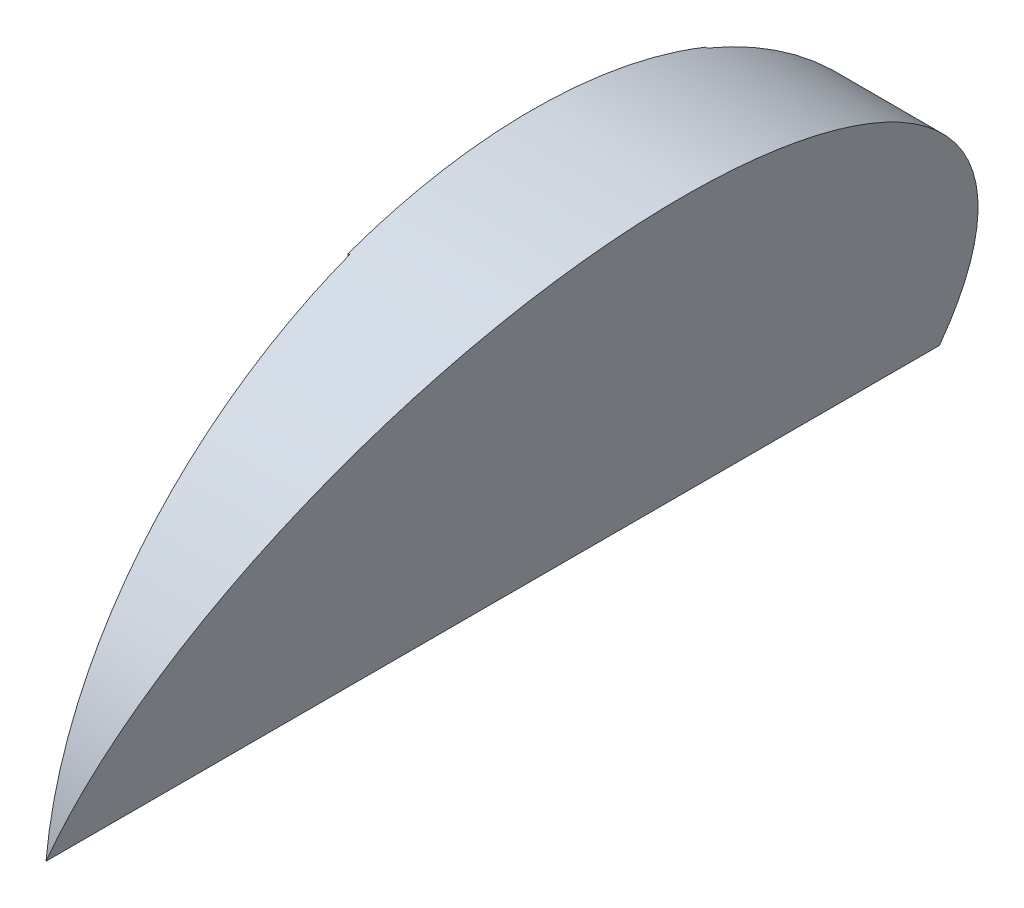
ISO-10303-21;
HEADER;
FILE_DESCRIPTION(('STEP AP214'),'2;1');
FILE_NAME('part.step','',(''),(''),'','','');
FILE_SCHEMA(('AUTOMOTIVE_DESIGN { 1 0 10303 214 1 1 1 1 }'));
ENDSEC;
DATA;
#1=APPLICATION_CONTEXT('core data for automotive mechanical design processes');
#2=APPLICATION_PROTOCOL_DEFINITION('international standard','automotive_design',2000,#1);
#3=PRODUCT_CONTEXT('',#1,'mechanical');
#4=PRODUCT('Part','Part','',(#3));
#5=PRODUCT_RELATED_PRODUCT_CATEGORY('part','',(#4));
#6=PRODUCT_DEFINITION_FORMATION('','',#4);
#7=PRODUCT_DEFINITION_CONTEXT('part definition',#1,'design');
#8=PRODUCT_DEFINITION('design','',#6,#7);
#9=PRODUCT_DEFINITION_SHAPE('','',#8);
#10=(LENGTH_UNIT() NAMED_UNIT(*) SI_UNIT(.MILLI.,.METRE.));
#11=(NAMED_UNIT(*) PLANE_ANGLE_UNIT() SI_UNIT($,.RADIAN.));
#12=(NAMED_UNIT(*) SI_UNIT($,.STERADIAN.) SOLID_ANGLE_UNIT());
#13=UNCERTAINTY_MEASURE_WITH_UNIT(LENGTH_MEASURE(1.E-05),#10,'distance_accuracy_value','');
#14=(GEOMETRIC_REPRESENTATION_CONTEXT(3) GLOBAL_UNCERTAINTY_ASSIGNED_CONTEXT((#13)) GLOBAL_UNIT_ASSIGNED_CONTEXT((#10,
#11,#12)) REPRESENTATION_CONTEXT('',''));
#15=CARTESIAN_POINT('',(0.,0.,0.));
#16=DIRECTION('',(0.,0.,1.));
#17=DIRECTION('',(1.,0.,0.));
#18=AXIS2_PLACEMENT_3D('',#15,#16,#17);
#19=CARTESIAN_POINT('',(6.99909308207423,80.,-80.));
#20=DIRECTION('',(-0.996194698091745,0.087155742747662,0.));
#21=DIRECTION('',(-0.087155742747662,-0.996194698091745,0.));
#22=AXIS2_PLACEMENT_3D('',#19,#20,#21);
#23=PLANE('',#22);
#24=CARTESIAN_POINT('',(0.,0.,0.));
#25=DIRECTION('',(-0.996194698091745,0.087155742747662,0.));
#26=DIRECTION('',(-0.087155742747662,-0.996194698091745,0.));
#27=AXIS2_PLACEMENT_3D('',#24,#25,#26);
#28=ELLIPSE('',#27,80.3055870034678,80.);
#29=CARTESIAN_POINT('',(6.41477476892939,73.3212111192935,32.));
#30=VERTEX_POINT('',#29);
#31=CARTESIAN_POINT('',(0.,0.,80.));
#32=VERTEX_POINT('',#31);
#33=EDGE_CURVE('E180',#30,#32,#28,.F.);
#34=ORIENTED_EDGE('',*,*,#33,.F.);
#35=DIRECTION('',(-0.0871557427476621,-0.996194698091745,0.));
#36=VECTOR('',#35,1.);
#37=CARTESIAN_POINT('',(6.99909308207423,80.,32.));
#38=LINE('',#37,#36);
#39=CARTESIAN_POINT('',(0.,0.,32.));
#40=VERTEX_POINT('',#39);
#41=EDGE_CURVE('E189',#30,#40,#38,.T.);
#42=ORIENTED_EDGE('',*,*,#41,.T.);
#43=DIRECTION('',(0.,0.,1.));
#44=VECTOR('',#43,1.);
#45=CARTESIAN_POINT('',(0.,0.,-80.));
#46=LINE('',#45,#44);
#47=EDGE_CURVE('E232',#40,#32,#46,.T.);
#48=ORIENTED_EDGE('',*,*,#47,.T.);
#49=EDGE_LOOP('',(#34,#42,#48));
#50=FACE_BOUND('',#49,.T.);
#51=ADVANCED_FACE('F36',(#50),#23,.T.);
#52=CARTESIAN_POINT('',(0.,0.,0.));
#53=DIRECTION('',(-0.996194698091745,0.087155742747662,0.));
#54=DIRECTION('',(-0.087155742747662,-0.996194698091745,0.));
#55=AXIS2_PLACEMENT_3D('',#52,#53,#54);
#56=ELLIPSE('',#55,80.3055870034678,80.);
#57=CARTESIAN_POINT('',(0.,0.,-80.));
#58=VERTEX_POINT('',#57);
#59=CARTESIAN_POINT('',(6.41477476892939,73.3212111192935,-32.));
#60=VERTEX_POINT('',#59);
#61=EDGE_CURVE('E186',#58,#60,#56,.F.);
#62=ORIENTED_EDGE('',*,*,#61,.F.);
#63=CARTESIAN_POINT('',(0.,0.,-32.));
#64=VERTEX_POINT('',#63);
#65=EDGE_CURVE('E235',#58,#64,#46,.T.);
#66=ORIENTED_EDGE('',*,*,#65,.T.);
#67=DIRECTION('',(-0.0871557427476621,-0.996194698091745,0.));
#68=VECTOR('',#67,1.);
#69=CARTESIAN_POINT('',(6.99909308207423,80.,-32.));
#70=LINE('',#69,#68);
#71=EDGE_CURVE('E204',#60,#64,#70,.T.);
#72=ORIENTED_EDGE('',*,*,#71,.F.);
#73=EDGE_LOOP('',(#62,#66,#72));
#74=FACE_BOUND('',#73,.T.);
#75=ADVANCED_FACE('F38',(#74),#23,.T.);
#76=CARTESIAN_POINT('',(0.,0.,-80.));
#77=DIRECTION('',(0.920504853452441,-0.390731128489271,0.));
#78=DIRECTION('',(0.390731128489271,0.920504853452441,0.));
#79=AXIS2_PLACEMENT_3D('',#76,#77,#78);
#80=PLANE('',#79);
#81=CARTESIAN_POINT('',(0.,0.,0.));
#82=DIRECTION('',(0.920504853452441,-0.390731128489271,0.));
#83=DIRECTION('',(-0.390731128489271,-0.920504853452441,0.));
#84=AXIS2_PLACEMENT_3D('',#81,#82,#83);
#85=ELLIPSE('',#84,86.9088301924236,80.);
#86=EDGE_CURVE('E187',#32,#58,#85,.F.);
#87=ORIENTED_EDGE('',*,*,#86,.F.);
#88=ORIENTED_EDGE('',*,*,#47,.F.);
#89=DIRECTION('',(0.,0.,1.));
#90=VECTOR('',#89,1.);
#91=CARTESIAN_POINT('',(0.,0.,-32.));
#92=LINE('',#91,#90);
#93=EDGE_CURVE('E227',#64,#40,#92,.T.);
#94=ORIENTED_EDGE('',*,*,#93,.F.);
#95=ORIENTED_EDGE('',*,*,#65,.F.);
#96=EDGE_LOOP('',(#87,#88,#94,#95));
#97=FACE_BOUND('',#96,.T.);
#98=ADVANCED_FACE('F286',(#97),#80,.T.);
#99=CARTESIAN_POINT('',(-3.,4.,-32.));
#100=DIRECTION('',(-0.8,-0.6,0.));
#101=DIRECTION('',(0.6,-0.8,0.));
#102=AXIS2_PLACEMENT_3D('',#99,#100,#101);
#103=PLANE('',#102);
#104=ORIENTED_EDGE('',*,*,#93,.T.);
#105=DIRECTION('',(0.6,-0.8,0.));
#106=VECTOR('',#105,1.);
#107=CARTESIAN_POINT('',(-3.,4.,32.));
#108=LINE('',#107,#106);
#109=CARTESIAN_POINT('',(-3.,4.,32.));
#110=VERTEX_POINT('',#109);
#111=EDGE_CURVE('E198',#110,#40,#108,.T.);
#112=ORIENTED_EDGE('',*,*,#111,.F.);
#113=DIRECTION('',(0.,0.,1.));
#114=VECTOR('',#113,1.);
#115=CARTESIAN_POINT('',(-3.,4.,-32.));
#116=LINE('',#115,#114);
#117=CARTESIAN_POINT('',(-3.,4.,-32.));
#118=VERTEX_POINT('',#117);
#119=EDGE_CURVE('E224',#118,#110,#116,.T.);
#120=ORIENTED_EDGE('',*,*,#119,.F.);
#121=DIRECTION('',(0.6,-0.8,0.));
#122=VECTOR('',#121,1.);
#123=CARTESIAN_POINT('',(-3.,4.,-32.));
#124=LINE('',#123,#122);
#125=EDGE_CURVE('E228',#118,#64,#124,.T.);
#126=ORIENTED_EDGE('',*,*,#125,.T.);
#127=EDGE_LOOP('',(#104,#112,#120,#126));
#128=FACE_BOUND('',#127,.T.);
#129=ADVANCED_FACE('F222',(#128),#103,.T.);
#130=CARTESIAN_POINT('',(6.99909308207423,80.,-32.));
#131=DIRECTION('',(-0.991455825714397,0.130442882737935,0.));
#132=DIRECTION('',(-0.130442882737935,-0.991455825714397,0.));
#133=AXIS2_PLACEMENT_3D('',#130,#131,#132);
#134=PLANE('',#133);
#135=DIRECTION('',(0.130442882737935,0.991455825714397,0.));
#136=VECTOR('',#135,1.);
#137=CARTESIAN_POINT('',(6.99909308207423,80.,25.5));
#138=LINE('',#137,#136);
#139=CARTESIAN_POINT('',(4.89402085426913,64.,25.5));
#140=VERTEX_POINT('',#139);
#141=CARTESIAN_POINT('',(5.28872189698258,67.,25.5));
#142=VERTEX_POINT('',#141);
#143=EDGE_CURVE('E12',#140,#142,#138,.T.);
#144=ORIENTED_EDGE('',*,*,#143,.F.);
#145=DIRECTION('',(0.,0.,1.));
#146=VECTOR('',#145,1.);
#147=CARTESIAN_POINT('',(4.89402085426913,64.,-32.));
#148=LINE('',#147,#146);
#149=CARTESIAN_POINT('',(4.89402085426913,64.,-25.5));
#150=VERTEX_POINT('',#149);
#151=EDGE_CURVE('E133',#150,#140,#148,.T.);
#152=ORIENTED_EDGE('',*,*,#151,.F.);
#153=DIRECTION('',(-0.130442882737935,-0.991455825714397,0.));
#154=VECTOR('',#153,1.);
#155=CARTESIAN_POINT('',(6.99909308207423,80.,-25.5));
#156=LINE('',#155,#154);
#157=CARTESIAN_POINT('',(5.28872189698259,67.,-25.5));
#158=VERTEX_POINT('',#157);
#159=EDGE_CURVE('E258',#158,#150,#156,.T.);
#160=ORIENTED_EDGE('',*,*,#159,.F.);
#161=DIRECTION('',(0.,0.,-1.));
#162=VECTOR('',#161,1.);
#163=CARTESIAN_POINT('',(5.28872189698259,67.,-32.));
#164=LINE('',#163,#162);
#165=EDGE_CURVE('E44',#142,#158,#164,.T.);
#166=ORIENTED_EDGE('',*,*,#165,.F.);
#167=EDGE_LOOP('',(#144,#152,#160,#166));
#168=FACE_BOUND('',#167,.T.);
#169=DIRECTION('',(0.130442882737935,0.991455825714397,0.));
#170=VECTOR('',#169,1.);
#171=CARTESIAN_POINT('',(6.99909308207423,80.,25.5));
#172=LINE('',#171,#170);
#173=CARTESIAN_POINT('',(5.68342293969604,70.,25.5));
#174=VERTEX_POINT('',#173);
#175=CARTESIAN_POINT('',(6.0781239824095,73.,25.5));
#176=VERTEX_POINT('',#175);
#177=EDGE_CURVE('E255',#174,#176,#172,.T.);
#178=ORIENTED_EDGE('',*,*,#177,.F.);
#179=DIRECTION('',(0.,0.,1.));
#180=VECTOR('',#179,1.);
#181=CARTESIAN_POINT('',(5.68342293969605,70.,-32.));
#182=LINE('',#181,#180);
#183=CARTESIAN_POINT('',(5.68342293969605,70.,-25.5));
#184=VERTEX_POINT('',#183);
#185=EDGE_CURVE('E249',#184,#174,#182,.T.);
#186=ORIENTED_EDGE('',*,*,#185,.F.);
#187=DIRECTION('',(-0.130442882737935,-0.991455825714397,0.));
#188=VECTOR('',#187,1.);
#189=CARTESIAN_POINT('',(6.99909308207423,80.,-25.5));
#190=LINE('',#189,#188);
#191=CARTESIAN_POINT('',(6.0781239824095,73.,-25.5));
#192=VERTEX_POINT('',#191);
#193=EDGE_CURVE('E251',#192,#184,#190,.T.);
#194=ORIENTED_EDGE('',*,*,#193,.F.);
#195=DIRECTION('',(0.,0.,-1.));
#196=VECTOR('',#195,1.);
#197=CARTESIAN_POINT('',(6.0781239824095,73.,-32.));
#198=LINE('',#197,#196);
#199=EDGE_CURVE('E253',#176,#192,#198,.T.);
#200=ORIENTED_EDGE('',*,*,#199,.F.);
#201=EDGE_LOOP('',(#178,#186,#194,#200));
#202=FACE_BOUND('',#201,.T.);
#203=CARTESIAN_POINT('',(-3.52626805695128,0.,0.));
#204=DIRECTION('',(-0.991455825714397,0.130442882737935,0.));
#205=DIRECTION('',(-0.130442882737935,-0.991455825714397,0.));
#206=AXIS2_PLACEMENT_3D('',#203,#204,#205);
#207=ELLIPSE('',#206,80.6894245059841,80.);
#208=CARTESIAN_POINT('',(6.12038477031493,73.3212111192935,-32.));
#209=VERTEX_POINT('',#208);
#210=CARTESIAN_POINT('',(6.12038477031493,73.3212111192935,32.));
#211=VERTEX_POINT('',#210);
#212=EDGE_CURVE('E174',#209,#211,#207,.F.);
#213=ORIENTED_EDGE('',*,*,#212,.F.);
#214=DIRECTION('',(-0.130442882737935,-0.991455825714397,0.));
#215=VECTOR('',#214,1.);
#216=CARTESIAN_POINT('',(6.99909308207423,80.,-32.));
#217=LINE('',#216,#215);
#218=EDGE_CURVE('E237',#209,#118,#217,.T.);
#219=ORIENTED_EDGE('',*,*,#218,.T.);
#220=ORIENTED_EDGE('',*,*,#119,.T.);
#221=DIRECTION('',(-0.130442882737935,-0.991455825714397,0.));
#222=VECTOR('',#221,1.);
#223=CARTESIAN_POINT('',(6.99909308207423,80.,32.));
#224=LINE('',#223,#222);
#225=EDGE_CURVE('E201',#211,#110,#224,.T.);
#226=ORIENTED_EDGE('',*,*,#225,.F.);
#227=EDGE_LOOP('',(#213,#219,#220,#226));
#228=FACE_BOUND('',#227,.T.);
#229=ADVANCED_FACE('F267',(#168,#202,#228),#134,.T.);
#230=CARTESIAN_POINT('',(0.,0.,-32.));
#231=DIRECTION('',(0.,0.,1.));
#232=DIRECTION('',(1.,0.,0.));
#233=AXIS2_PLACEMENT_3D('',#230,#231,#232);
#234=PLANE('',#233);
#235=ORIENTED_EDGE('',*,*,#218,.F.);
#236=DIRECTION('',(-1.,0.,0.));
#237=VECTOR('',#236,1.);
#238=CARTESIAN_POINT('',(33.9579852967681,73.3212111192935,-32.));
#239=LINE('',#238,#237);
#240=EDGE_CURVE('E183',#209,#60,#239,.F.);
#241=ORIENTED_EDGE('',*,*,#240,.T.);
#242=ORIENTED_EDGE('',*,*,#71,.T.);
#243=ORIENTED_EDGE('',*,*,#125,.F.);
#244=EDGE_LOOP('',(#235,#241,#242,#243));
#245=FACE_BOUND('',#244,.T.);
#246=ADVANCED_FACE('F270',(#245),#234,.F.);
#247=CARTESIAN_POINT('',(0.,0.,32.));
#248=DIRECTION('',(0.,0.,1.));
#249=DIRECTION('',(1.,0.,0.));
#250=AXIS2_PLACEMENT_3D('',#247,#248,#249);
#251=PLANE('',#250);
#252=DIRECTION('',(-1.,0.,0.));
#253=VECTOR('',#252,1.);
#254=CARTESIAN_POINT('',(33.9579852967681,73.3212111192935,32.));
#255=LINE('',#254,#253);
#256=EDGE_CURVE('E205',#211,#30,#255,.F.);
#257=ORIENTED_EDGE('',*,*,#256,.F.);
#258=ORIENTED_EDGE('',*,*,#225,.T.);
#259=ORIENTED_EDGE('',*,*,#111,.T.);
#260=ORIENTED_EDGE('',*,*,#41,.F.);
#261=EDGE_LOOP('',(#257,#258,#259,#260));
#262=FACE_BOUND('',#261,.T.);
#263=ADVANCED_FACE('F216',(#262),#251,.T.);
#264=CARTESIAN_POINT('',(33.9579852967681,0.,0.));
#265=DIRECTION('',(-1.,0.,0.));
#266=DIRECTION('',(0.,0.,1.));
#267=AXIS2_PLACEMENT_3D('',#264,#265,#266);
#268=CYLINDRICAL_SURFACE('',#267,80.);
#269=ORIENTED_EDGE('',*,*,#212,.T.);
#270=ORIENTED_EDGE('',*,*,#256,.T.);
#271=ORIENTED_EDGE('',*,*,#33,.T.);
#272=ORIENTED_EDGE('',*,*,#86,.T.);
#273=ORIENTED_EDGE('',*,*,#61,.T.);
#274=ORIENTED_EDGE('',*,*,#240,.F.);
#275=EDGE_LOOP('',(#269,#270,#271,#272,#273,#274));
#276=FACE_BOUND('',#275,.T.);
#277=ADVANCED_FACE('F284',(#276),#268,.T.);
#278=CARTESIAN_POINT('',(-3.000025,73.,25.5));
#279=DIRECTION('',(0.,0.,1.));
#280=DIRECTION('',(1.,0.,0.));
#281=AXIS2_PLACEMENT_3D('',#278,#279,#280);
#282=PLANE('',#281);
#283=ORIENTED_EDGE('',*,*,#177,.T.);
#284=DIRECTION('',(1.,0.,0.));
#285=VECTOR('',#284,1.);
#286=CARTESIAN_POINT('',(-3.000025,73.,25.5));
#287=LINE('',#286,#285);
#288=CARTESIAN_POINT('',(11.9579852967681,73.,25.5));
#289=VERTEX_POINT('',#288);
#290=EDGE_CURVE('E172',#176,#289,#287,.T.);
#291=ORIENTED_EDGE('',*,*,#290,.T.);
#292=DIRECTION('',(0.,-1.,0.));
#293=VECTOR('',#292,1.);
#294=CARTESIAN_POINT('',(11.9579852967681,73.,25.5));
#295=LINE('',#294,#293);
#296=CARTESIAN_POINT('',(11.9579852967681,70.,25.5));
#297=VERTEX_POINT('',#296);
#298=EDGE_CURVE('E157',#289,#297,#295,.T.);
#299=ORIENTED_EDGE('',*,*,#298,.T.);
#300=DIRECTION('',(1.,0.,0.));
#301=VECTOR('',#300,1.);
#302=CARTESIAN_POINT('',(-3.000025,70.,25.5));
#303=LINE('',#302,#301);
#304=EDGE_CURVE('E171',#174,#297,#303,.T.);
#305=ORIENTED_EDGE('',*,*,#304,.F.);
#306=EDGE_LOOP('',(#283,#291,#299,#305));
#307=FACE_BOUND('',#306,.T.);
#308=ADVANCED_FACE('F331',(#307),#282,.F.);
#309=CARTESIAN_POINT('',(-3.000025,73.,25.5));
#310=DIRECTION('',(0.,1.,0.));
#311=DIRECTION('',(0.,0.,1.));
#312=AXIS2_PLACEMENT_3D('',#309,#310,#311);
#313=PLANE('',#312);
#314=ORIENTED_EDGE('',*,*,#199,.T.);
#315=DIRECTION('',(1.,0.,0.));
#316=VECTOR('',#315,1.);
#317=CARTESIAN_POINT('',(-3.000025,73.,-25.5));
#318=LINE('',#317,#316);
#319=CARTESIAN_POINT('',(11.9579852967681,73.,-25.5));
#320=VERTEX_POINT('',#319);
#321=EDGE_CURVE('E175',#192,#320,#318,.T.);
#322=ORIENTED_EDGE('',*,*,#321,.T.);
#323=DIRECTION('',(0.,0.,1.));
#324=VECTOR('',#323,1.);
#325=CARTESIAN_POINT('',(11.9579852967681,73.,25.5));
#326=LINE('',#325,#324);
#327=EDGE_CURVE('E168',#320,#289,#326,.T.);
#328=ORIENTED_EDGE('',*,*,#327,.T.);
#329=ORIENTED_EDGE('',*,*,#290,.F.);
#330=EDGE_LOOP('',(#314,#322,#328,#329));
#331=FACE_BOUND('',#330,.T.);
#332=ADVANCED_FACE('F346',(#331),#313,.F.);
#333=CARTESIAN_POINT('',(-3.000025,73.,-25.5));
#334=DIRECTION('',(0.,0.,-1.));
#335=DIRECTION('',(-1.,0.,0.));
#336=AXIS2_PLACEMENT_3D('',#333,#334,#335);
#337=PLANE('',#336);
#338=ORIENTED_EDGE('',*,*,#193,.T.);
#339=DIRECTION('',(1.,0.,0.));
#340=VECTOR('',#339,1.);
#341=CARTESIAN_POINT('',(-3.000025,70.,-25.5));
#342=LINE('',#341,#340);
#343=CARTESIAN_POINT('',(11.9579852967681,70.,-25.5));
#344=VERTEX_POINT('',#343);
#345=EDGE_CURVE('E59',#184,#344,#342,.T.);
#346=ORIENTED_EDGE('',*,*,#345,.T.);
#347=DIRECTION('',(0.,1.,0.));
#348=VECTOR('',#347,1.);
#349=CARTESIAN_POINT('',(11.9579852967681,73.,-25.5));
#350=LINE('',#349,#348);
#351=EDGE_CURVE('E165',#344,#320,#350,.T.);
#352=ORIENTED_EDGE('',*,*,#351,.T.);
#353=ORIENTED_EDGE('',*,*,#321,.F.);
#354=EDGE_LOOP('',(#338,#346,#352,#353));
#355=FACE_BOUND('',#354,.T.);
#356=ADVANCED_FACE('F356',(#355),#337,.F.);
#357=CARTESIAN_POINT('',(-3.000025,70.,25.5));
#358=DIRECTION('',(0.,-1.,0.));
#359=DIRECTION('',(0.,0.,-1.));
#360=AXIS2_PLACEMENT_3D('',#357,#358,#359);
#361=PLANE('',#360);
#362=ORIENTED_EDGE('',*,*,#185,.T.);
#363=ORIENTED_EDGE('',*,*,#304,.T.);
#364=DIRECTION('',(0.,0.,-1.));
#365=VECTOR('',#364,1.);
#366=CARTESIAN_POINT('',(11.9579852967681,70.,25.5));
#367=LINE('',#366,#365);
#368=EDGE_CURVE('E163',#297,#344,#367,.T.);
#369=ORIENTED_EDGE('',*,*,#368,.T.);
#370=ORIENTED_EDGE('',*,*,#345,.F.);
#371=EDGE_LOOP('',(#362,#363,#369,#370));
#372=FACE_BOUND('',#371,.T.);
#373=ADVANCED_FACE('F366',(#372),#361,.F.);
#374=CARTESIAN_POINT('',(11.9579852967681,0.,0.));
#375=DIRECTION('',(1.,0.,0.));
#376=DIRECTION('',(0.,0.,-1.));
#377=AXIS2_PLACEMENT_3D('',#374,#375,#376);
#378=PLANE('',#377);
#379=ORIENTED_EDGE('',*,*,#298,.F.);
#380=ORIENTED_EDGE('',*,*,#327,.F.);
#381=ORIENTED_EDGE('',*,*,#351,.F.);
#382=ORIENTED_EDGE('',*,*,#368,.F.);
#383=EDGE_LOOP('',(#379,#380,#381,#382));
#384=FACE_BOUND('',#383,.T.);
#385=ADVANCED_FACE('F376',(#384),#378,.F.);
#386=CARTESIAN_POINT('',(-3.000025,67.,25.5));
#387=DIRECTION('',(0.,0.,1.));
#388=DIRECTION('',(1.,0.,0.));
#389=AXIS2_PLACEMENT_3D('',#386,#387,#388);
#390=PLANE('',#389);
#391=ORIENTED_EDGE('',*,*,#143,.T.);
#392=DIRECTION('',(1.,0.,0.));
#393=VECTOR('',#392,1.);
#394=CARTESIAN_POINT('',(-3.000025,67.,25.5));
#395=LINE('',#394,#393);
#396=CARTESIAN_POINT('',(11.9579852967681,67.,25.5));
#397=VERTEX_POINT('',#396);
#398=EDGE_CURVE('E151',#142,#397,#395,.T.);
#399=ORIENTED_EDGE('',*,*,#398,.T.);
#400=DIRECTION('',(0.,-1.,0.));
#401=VECTOR('',#400,1.);
#402=CARTESIAN_POINT('',(11.9579852967681,67.,25.5));
#403=LINE('',#402,#401);
#404=CARTESIAN_POINT('',(11.9579852967681,64.,25.5));
#405=VERTEX_POINT('',#404);
#406=EDGE_CURVE('E144',#397,#405,#403,.T.);
#407=ORIENTED_EDGE('',*,*,#406,.T.);
#408=DIRECTION('',(1.,0.,0.));
#409=VECTOR('',#408,1.);
#410=CARTESIAN_POINT('',(-3.000025,64.,25.5));
#411=LINE('',#410,#409);
#412=EDGE_CURVE('E128',#140,#405,#411,.T.);
#413=ORIENTED_EDGE('',*,*,#412,.F.);
#414=EDGE_LOOP('',(#391,#399,#407,#413));
#415=FACE_BOUND('',#414,.T.);
#416=ADVANCED_FACE('F149',(#415),#390,.F.);
#417=CARTESIAN_POINT('',(-3.000025,67.,25.5));
#418=DIRECTION('',(0.,1.,0.));
#419=DIRECTION('',(0.,0.,1.));
#420=AXIS2_PLACEMENT_3D('',#417,#418,#419);
#421=PLANE('',#420);
#422=ORIENTED_EDGE('',*,*,#165,.T.);
#423=DIRECTION('',(1.,0.,0.));
#424=VECTOR('',#423,1.);
#425=CARTESIAN_POINT('',(-3.000025,67.,-25.5));
#426=LINE('',#425,#424);
#427=CARTESIAN_POINT('',(11.9579852967681,67.,-25.5));
#428=VERTEX_POINT('',#427);
#429=EDGE_CURVE('E158',#158,#428,#426,.T.);
#430=ORIENTED_EDGE('',*,*,#429,.T.);
#431=DIRECTION('',(0.,0.,1.));
#432=VECTOR('',#431,1.);
#433=CARTESIAN_POINT('',(11.9579852967681,67.,25.5));
#434=LINE('',#433,#432);
#435=EDGE_CURVE('E137',#428,#397,#434,.T.);
#436=ORIENTED_EDGE('',*,*,#435,.T.);
#437=ORIENTED_EDGE('',*,*,#398,.F.);
#438=EDGE_LOOP('',(#422,#430,#436,#437));
#439=FACE_BOUND('',#438,.T.);
#440=ADVANCED_FACE('F262',(#439),#421,.F.);
#441=CARTESIAN_POINT('',(-3.000025,67.,-25.5));
#442=DIRECTION('',(0.,0.,-1.));
#443=DIRECTION('',(-1.,0.,0.));
#444=AXIS2_PLACEMENT_3D('',#441,#442,#443);
#445=PLANE('',#444);
#446=ORIENTED_EDGE('',*,*,#159,.T.);
#447=DIRECTION('',(1.,0.,0.));
#448=VECTOR('',#447,1.);
#449=CARTESIAN_POINT('',(-3.000025,64.,-25.5));
#450=LINE('',#449,#448);
#451=CARTESIAN_POINT('',(11.9579852967681,64.,-25.5));
#452=VERTEX_POINT('',#451);
#453=EDGE_CURVE('E51',#150,#452,#450,.T.);
#454=ORIENTED_EDGE('',*,*,#453,.T.);
#455=DIRECTION('',(0.,1.,0.));
#456=VECTOR('',#455,1.);
#457=CARTESIAN_POINT('',(11.9579852967681,67.,-25.5));
#458=LINE('',#457,#456);
#459=EDGE_CURVE('E147',#452,#428,#458,.T.);
#460=ORIENTED_EDGE('',*,*,#459,.T.);
#461=ORIENTED_EDGE('',*,*,#429,.F.);
#462=EDGE_LOOP('',(#446,#454,#460,#461));
#463=FACE_BOUND('',#462,.T.);
#464=ADVANCED_FACE('F266',(#463),#445,.F.);
#465=CARTESIAN_POINT('',(-3.000025,64.,25.5));
#466=DIRECTION('',(0.,-1.,0.));
#467=DIRECTION('',(0.,0.,-1.));
#468=AXIS2_PLACEMENT_3D('',#465,#466,#467);
#469=PLANE('',#468);
#470=ORIENTED_EDGE('',*,*,#151,.T.);
#471=ORIENTED_EDGE('',*,*,#412,.T.);
#472=DIRECTION('',(0.,0.,-1.));
#473=VECTOR('',#472,1.);
#474=CARTESIAN_POINT('',(11.9579852967681,64.,25.5));
#475=LINE('',#474,#473);
#476=EDGE_CURVE('E131',#405,#452,#475,.T.);
#477=ORIENTED_EDGE('',*,*,#476,.T.);
#478=ORIENTED_EDGE('',*,*,#453,.F.);
#479=EDGE_LOOP('',(#470,#471,#477,#478));
#480=FACE_BOUND('',#479,.T.);
#481=ADVANCED_FACE('F130',(#480),#469,.F.);
#482=CARTESIAN_POINT('',(11.9579852967681,0.,0.));
#483=DIRECTION('',(1.,0.,0.));
#484=DIRECTION('',(0.,0.,-1.));
#485=AXIS2_PLACEMENT_3D('',#482,#483,#484);
#486=PLANE('',#485);
#487=ORIENTED_EDGE('',*,*,#406,.F.);
#488=ORIENTED_EDGE('',*,*,#435,.F.);
#489=ORIENTED_EDGE('',*,*,#459,.F.);
#490=ORIENTED_EDGE('',*,*,#476,.F.);
#491=EDGE_LOOP('',(#487,#488,#489,#490));
#492=FACE_BOUND('',#491,.T.);
#493=ADVANCED_FACE('F142',(#492),#486,.F.);
#494=CLOSED_SHELL('',(#51,#75,#98,#129,#229,#246,#263,#277,#308,#332,#356,#373,#385,#416,#440,
#464,#481,#493));
#495=MANIFOLD_SOLID_BREP('B2',#494);
#496=ADVANCED_BREP_SHAPE_REPRESENTATION('',(#18,#495),#14);
#497=SHAPE_DEFINITION_REPRESENTATION(#9,#496);
ENDSEC;
END-ISO-10303-21;
